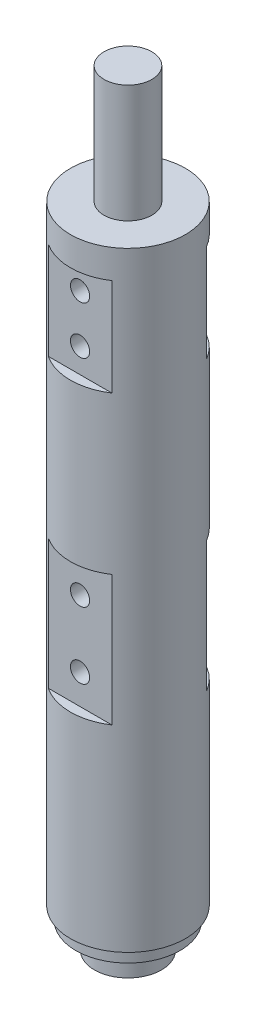
ISO-10303-21;
HEADER;
FILE_DESCRIPTION(('STEP AP214'),'2;1');
FILE_NAME('part.step','',(''),(''),'','','');
FILE_SCHEMA(('AUTOMOTIVE_DESIGN { 1 0 10303 214 1 1 1 1 }'));
ENDSEC;
DATA;
#1=APPLICATION_CONTEXT('core data for automotive mechanical design processes');
#2=APPLICATION_PROTOCOL_DEFINITION('international standard','automotive_design',2000,#1);
#3=PRODUCT_CONTEXT('',#1,'mechanical');
#4=PRODUCT('Part','Part','',(#3));
#5=PRODUCT_RELATED_PRODUCT_CATEGORY('part','',(#4));
#6=PRODUCT_DEFINITION_FORMATION('','',#4);
#7=PRODUCT_DEFINITION_CONTEXT('part definition',#1,'design');
#8=PRODUCT_DEFINITION('design','',#6,#7);
#9=PRODUCT_DEFINITION_SHAPE('','',#8);
#10=(LENGTH_UNIT() NAMED_UNIT(*) SI_UNIT(.MILLI.,.METRE.));
#11=(NAMED_UNIT(*) PLANE_ANGLE_UNIT() SI_UNIT($,.RADIAN.));
#12=(NAMED_UNIT(*) SI_UNIT($,.STERADIAN.) SOLID_ANGLE_UNIT());
#13=UNCERTAINTY_MEASURE_WITH_UNIT(LENGTH_MEASURE(1.E-05),#10,'distance_accuracy_value','');
#14=(GEOMETRIC_REPRESENTATION_CONTEXT(3) GLOBAL_UNCERTAINTY_ASSIGNED_CONTEXT((#13)) GLOBAL_UNIT_ASSIGNED_CONTEXT((#10,
#11,#12)) REPRESENTATION_CONTEXT('',''));
#15=CARTESIAN_POINT('',(0.,0.,0.));
#16=DIRECTION('',(0.,0.,1.));
#17=DIRECTION('',(1.,0.,0.));
#18=AXIS2_PLACEMENT_3D('',#15,#16,#17);
#19=CARTESIAN_POINT('',(0.,254.,0.));
#20=DIRECTION('',(0.,-1.,0.));
#21=DIRECTION('',(0.,0.,-1.));
#22=AXIS2_PLACEMENT_3D('',#19,#20,#21);
#23=CYLINDRICAL_SURFACE('',#22,19.05);
#24=DIRECTION('',(0.,-1.,0.));
#25=VECTOR('',#24,1.);
#26=CARTESIAN_POINT('',(10.5302837093785,254.,15.8749999999999));
#27=LINE('',#26,#25);
#28=CARTESIAN_POINT('',(10.5302837093785,121.158,15.8749999999999));
#29=VERTEX_POINT('',#28);
#30=CARTESIAN_POINT('',(10.5302837093785,77.978,15.8749999999999));
#31=VERTEX_POINT('',#30);
#32=EDGE_CURVE('E11',#29,#31,#27,.T.);
#33=ORIENTED_EDGE('',*,*,#32,.T.);
#34=CARTESIAN_POINT('',(0.,77.978,0.));
#35=DIRECTION('',(0.,-1.,0.));
#36=DIRECTION('',(0.,0.,-1.));
#37=AXIS2_PLACEMENT_3D('',#34,#35,#36);
#38=CIRCLE('',#37,19.05);
#39=CARTESIAN_POINT('',(-10.5302837093785,77.978,15.8749999999999));
#40=VERTEX_POINT('',#39);
#41=EDGE_CURVE('E96',#31,#40,#38,.T.);
#42=ORIENTED_EDGE('',*,*,#41,.T.);
#43=DIRECTION('',(0.,-1.,0.));
#44=VECTOR('',#43,1.);
#45=CARTESIAN_POINT('',(-10.5302837093785,254.,15.8749999999999));
#46=LINE('',#45,#44);
#47=CARTESIAN_POINT('',(-10.5302837093785,121.158,15.8749999999999));
#48=VERTEX_POINT('',#47);
#49=EDGE_CURVE('E100',#40,#48,#46,.F.);
#50=ORIENTED_EDGE('',*,*,#49,.T.);
#51=CARTESIAN_POINT('',(0.,121.158,0.));
#52=DIRECTION('',(0.,1.,0.));
#53=DIRECTION('',(0.,0.,1.));
#54=AXIS2_PLACEMENT_3D('',#51,#52,#53);
#55=CIRCLE('',#54,19.05);
#56=EDGE_CURVE('E40',#48,#29,#55,.T.);
#57=ORIENTED_EDGE('',*,*,#56,.T.);
#58=EDGE_LOOP('',(#33,#42,#50,#57));
#59=FACE_BOUND('',#58,.T.);
#60=DIRECTION('',(0.,-1.,0.));
#61=VECTOR('',#60,1.);
#62=CARTESIAN_POINT('',(10.5302837093785,254.,15.8749999999999));
#63=LINE('',#62,#61);
#64=CARTESIAN_POINT('',(10.5302837093785,205.486,15.8749999999999));
#65=VERTEX_POINT('',#64);
#66=CARTESIAN_POINT('',(10.5302837093785,173.228,15.8749999999999));
#67=VERTEX_POINT('',#66);
#68=EDGE_CURVE('E101',#65,#67,#63,.T.);
#69=ORIENTED_EDGE('',*,*,#68,.T.);
#70=CARTESIAN_POINT('',(0.,173.228,0.));
#71=DIRECTION('',(0.,-1.,0.));
#72=DIRECTION('',(0.,0.,-1.));
#73=AXIS2_PLACEMENT_3D('',#70,#71,#72);
#74=CIRCLE('',#73,19.05);
#75=CARTESIAN_POINT('',(-10.5302837093785,173.228,15.8749999999999));
#76=VERTEX_POINT('',#75);
#77=EDGE_CURVE('E202',#67,#76,#74,.T.);
#78=ORIENTED_EDGE('',*,*,#77,.T.);
#79=DIRECTION('',(0.,-1.,0.));
#80=VECTOR('',#79,1.);
#81=CARTESIAN_POINT('',(-10.5302837093785,254.,15.8749999999999));
#82=LINE('',#81,#80);
#83=CARTESIAN_POINT('',(-10.5302837093785,205.486,15.8749999999999));
#84=VERTEX_POINT('',#83);
#85=EDGE_CURVE('E205',#76,#84,#82,.F.);
#86=ORIENTED_EDGE('',*,*,#85,.T.);
#87=CARTESIAN_POINT('',(0.,205.486,0.));
#88=DIRECTION('',(0.,1.,0.));
#89=DIRECTION('',(0.,0.,1.));
#90=AXIS2_PLACEMENT_3D('',#87,#88,#89);
#91=CIRCLE('',#90,19.05);
#92=EDGE_CURVE('E208',#84,#65,#91,.T.);
#93=ORIENTED_EDGE('',*,*,#92,.T.);
#94=EDGE_LOOP('',(#69,#78,#86,#93));
#95=FACE_BOUND('',#94,.T.);
#96=CARTESIAN_POINT('',(0.,77.978,0.));
#97=DIRECTION('',(0.,-1.,0.));
#98=DIRECTION('',(0.,0.,-1.));
#99=AXIS2_PLACEMENT_3D('',#96,#97,#98);
#100=CIRCLE('',#99,19.05);
#101=CARTESIAN_POINT('',(-16.4977839420936,77.978,-9.52500000000001));
#102=VERTEX_POINT('',#101);
#103=CARTESIAN_POINT('',(16.4977839420936,77.978,-9.52500000000001));
#104=VERTEX_POINT('',#103);
#105=EDGE_CURVE('E200',#102,#104,#100,.T.);
#106=ORIENTED_EDGE('',*,*,#105,.T.);
#107=DIRECTION('',(0.,-1.,0.));
#108=VECTOR('',#107,1.);
#109=CARTESIAN_POINT('',(16.4977839420936,254.,-9.52499999999998));
#110=LINE('',#109,#108);
#111=CARTESIAN_POINT('',(16.4977839420936,121.158,-9.525));
#112=VERTEX_POINT('',#111);
#113=EDGE_CURVE('E194',#104,#112,#110,.F.);
#114=ORIENTED_EDGE('',*,*,#113,.T.);
#115=CARTESIAN_POINT('',(0.,121.158,0.));
#116=DIRECTION('',(0.,1.,0.));
#117=DIRECTION('',(0.,0.,1.));
#118=AXIS2_PLACEMENT_3D('',#115,#116,#117);
#119=CIRCLE('',#118,19.05);
#120=CARTESIAN_POINT('',(-16.4977839420936,121.158,-9.525));
#121=VERTEX_POINT('',#120);
#122=EDGE_CURVE('E191',#112,#121,#119,.T.);
#123=ORIENTED_EDGE('',*,*,#122,.T.);
#124=DIRECTION('',(0.,-1.,0.));
#125=VECTOR('',#124,1.);
#126=CARTESIAN_POINT('',(-16.4977839420936,254.,-9.52499999999998));
#127=LINE('',#126,#125);
#128=EDGE_CURVE('E197',#121,#102,#127,.T.);
#129=ORIENTED_EDGE('',*,*,#128,.T.);
#130=EDGE_LOOP('',(#106,#114,#123,#129));
#131=FACE_BOUND('',#130,.T.);
#132=CARTESIAN_POINT('',(0.,173.228,0.));
#133=DIRECTION('',(0.,-1.,0.));
#134=DIRECTION('',(0.,0.,-1.));
#135=AXIS2_PLACEMENT_3D('',#132,#133,#134);
#136=CIRCLE('',#135,19.05);
#137=CARTESIAN_POINT('',(-16.4977839420936,173.228,-9.525));
#138=VERTEX_POINT('',#137);
#139=CARTESIAN_POINT('',(16.4977839420935,173.228,-9.525));
#140=VERTEX_POINT('',#139);
#141=EDGE_CURVE('E189',#138,#140,#136,.T.);
#142=ORIENTED_EDGE('',*,*,#141,.T.);
#143=DIRECTION('',(0.,-1.,0.));
#144=VECTOR('',#143,1.);
#145=CARTESIAN_POINT('',(16.4977839420936,254.,-9.52499999999999));
#146=LINE('',#145,#144);
#147=CARTESIAN_POINT('',(16.4977839420936,205.486,-9.52499999999999));
#148=VERTEX_POINT('',#147);
#149=EDGE_CURVE('E183',#140,#148,#146,.F.);
#150=ORIENTED_EDGE('',*,*,#149,.T.);
#151=CARTESIAN_POINT('',(0.,205.486,0.));
#152=DIRECTION('',(0.,1.,0.));
#153=DIRECTION('',(0.,0.,1.));
#154=AXIS2_PLACEMENT_3D('',#151,#152,#153);
#155=CIRCLE('',#154,19.05);
#156=CARTESIAN_POINT('',(-16.4977839420936,205.486,-9.52499999999999));
#157=VERTEX_POINT('',#156);
#158=EDGE_CURVE('E180',#148,#157,#155,.T.);
#159=ORIENTED_EDGE('',*,*,#158,.T.);
#160=DIRECTION('',(0.,-1.,0.));
#161=VECTOR('',#160,1.);
#162=CARTESIAN_POINT('',(-16.4977839420936,254.,-9.52499999999999));
#163=LINE('',#162,#161);
#164=EDGE_CURVE('E186',#157,#138,#163,.T.);
#165=ORIENTED_EDGE('',*,*,#164,.T.);
#166=EDGE_LOOP('',(#142,#150,#159,#165));
#167=FACE_BOUND('',#166,.T.);
#168=CARTESIAN_POINT('',(0.,12.954,0.));
#169=DIRECTION('',(0.,1.,0.));
#170=DIRECTION('',(0.,0.,1.));
#171=AXIS2_PLACEMENT_3D('',#168,#169,#170);
#172=CIRCLE('',#171,19.05);
#173=CARTESIAN_POINT('',(0.,12.954,19.05));
#174=VERTEX_POINT('',#173);
#175=EDGE_CURVE('E165',#174,#174,#172,.T.);
#176=ORIENTED_EDGE('',*,*,#175,.T.);
#177=EDGE_LOOP('',(#176));
#178=FACE_BOUND('',#177,.T.);
#179=CARTESIAN_POINT('',(0.,215.011,0.));
#180=DIRECTION('',(0.,1.,0.));
#181=DIRECTION('',(0.,0.,1.));
#182=AXIS2_PLACEMENT_3D('',#179,#180,#181);
#183=CIRCLE('',#182,19.05);
#184=CARTESIAN_POINT('',(0.,215.011,19.05));
#185=VERTEX_POINT('',#184);
#186=EDGE_CURVE('E154',#185,#185,#183,.T.);
#187=ORIENTED_EDGE('',*,*,#186,.F.);
#188=EDGE_LOOP('',(#187));
#189=FACE_BOUND('',#188,.T.);
#190=ADVANCED_FACE('F32',(#59,#95,#131,#167,#178,#189),#23,.T.);
#191=CARTESIAN_POINT('',(0.,348.337253791726,0.));
#192=DIRECTION('',(0.,1.,0.));
#193=DIRECTION('',(0.,0.,1.));
#194=AXIS2_PLACEMENT_3D('',#191,#192,#193);
#195=CYLINDRICAL_SURFACE('',#194,11.1125);
#196=CARTESIAN_POINT('',(0.,0.,0.));
#197=DIRECTION('',(0.,1.,0.));
#198=DIRECTION('',(0.,0.,1.));
#199=AXIS2_PLACEMENT_3D('',#196,#197,#198);
#200=CIRCLE('',#199,11.1125);
#201=CARTESIAN_POINT('',(0.,0.,11.1125));
#202=VERTEX_POINT('',#201);
#203=EDGE_CURVE('E177',#202,#202,#200,.T.);
#204=ORIENTED_EDGE('',*,*,#203,.T.);
#205=EDGE_LOOP('',(#204));
#206=FACE_BOUND('',#205,.T.);
#207=CARTESIAN_POINT('',(0.,8.63599999999998,0.));
#208=DIRECTION('',(0.,1.,0.));
#209=DIRECTION('',(0.,0.,1.));
#210=AXIS2_PLACEMENT_3D('',#207,#208,#209);
#211=CIRCLE('',#210,11.1125);
#212=CARTESIAN_POINT('',(0.,8.63599999999998,11.1125));
#213=VERTEX_POINT('',#212);
#214=EDGE_CURVE('E174',#213,#213,#211,.T.);
#215=ORIENTED_EDGE('',*,*,#214,.F.);
#216=EDGE_LOOP('',(#215));
#217=FACE_BOUND('',#216,.T.);
#218=ADVANCED_FACE('F234',(#206,#217),#195,.T.);
#219=CARTESIAN_POINT('',(11.1125,8.636,0.));
#220=DIRECTION('',(0.,-1.,0.));
#221=DIRECTION('',(0.,0.,-1.));
#222=AXIS2_PLACEMENT_3D('',#219,#220,#221);
#223=PLANE('',#222);
#224=ORIENTED_EDGE('',*,*,#214,.T.);
#225=EDGE_LOOP('',(#224));
#226=FACE_BOUND('',#225,.T.);
#227=CARTESIAN_POINT('',(0.,8.63599999999998,0.));
#228=DIRECTION('',(0.,1.,0.));
#229=DIRECTION('',(0.,0.,1.));
#230=AXIS2_PLACEMENT_3D('',#227,#228,#229);
#231=CIRCLE('',#230,17.272);
#232=CARTESIAN_POINT('',(0.,8.63599999999998,17.272));
#233=VERTEX_POINT('',#232);
#234=EDGE_CURVE('E171',#233,#233,#231,.T.);
#235=ORIENTED_EDGE('',*,*,#234,.F.);
#236=EDGE_LOOP('',(#235));
#237=FACE_BOUND('',#236,.T.);
#238=ADVANCED_FACE('F238',(#226,#237),#223,.T.);
#239=CARTESIAN_POINT('',(0.,348.337253791726,0.));
#240=DIRECTION('',(0.,1.,0.));
#241=DIRECTION('',(0.,0.,1.));
#242=AXIS2_PLACEMENT_3D('',#239,#240,#241);
#243=CYLINDRICAL_SURFACE('',#242,17.272);
#244=ORIENTED_EDGE('',*,*,#234,.T.);
#245=EDGE_LOOP('',(#244));
#246=FACE_BOUND('',#245,.T.);
#247=CARTESIAN_POINT('',(0.,12.954,0.));
#248=DIRECTION('',(0.,1.,0.));
#249=DIRECTION('',(0.,0.,1.));
#250=AXIS2_PLACEMENT_3D('',#247,#248,#249);
#251=CIRCLE('',#250,17.272);
#252=CARTESIAN_POINT('',(0.,12.954,17.272));
#253=VERTEX_POINT('',#252);
#254=EDGE_CURVE('E168',#253,#253,#251,.T.);
#255=ORIENTED_EDGE('',*,*,#254,.F.);
#256=EDGE_LOOP('',(#255));
#257=FACE_BOUND('',#256,.T.);
#258=ADVANCED_FACE('F244',(#246,#257),#243,.T.);
#259=CARTESIAN_POINT('',(17.272,12.954,0.));
#260=DIRECTION('',(0.,-1.,0.));
#261=DIRECTION('',(0.,0.,-1.));
#262=AXIS2_PLACEMENT_3D('',#259,#260,#261);
#263=PLANE('',#262);
#264=ORIENTED_EDGE('',*,*,#254,.T.);
#265=EDGE_LOOP('',(#264));
#266=FACE_BOUND('',#265,.T.);
#267=ORIENTED_EDGE('',*,*,#175,.F.);
#268=EDGE_LOOP('',(#267));
#269=FACE_BOUND('',#268,.T.);
#270=ADVANCED_FACE('F258',(#266,#269),#263,.T.);
#271=CARTESIAN_POINT('',(0.,0.,0.));
#272=DIRECTION('',(0.,1.,0.));
#273=DIRECTION('',(0.,0.,1.));
#274=AXIS2_PLACEMENT_3D('',#271,#272,#273);
#275=PLANE('',#274);
#276=ORIENTED_EDGE('',*,*,#203,.F.);
#277=EDGE_LOOP('',(#276));
#278=FACE_BOUND('',#277,.T.);
#279=ADVANCED_FACE('F255',(#278),#275,.F.);
#280=CARTESIAN_POINT('',(19.05,215.011,0.));
#281=DIRECTION('',(0.,1.,0.));
#282=DIRECTION('',(0.,0.,1.));
#283=AXIS2_PLACEMENT_3D('',#280,#281,#282);
#284=PLANE('',#283);
#285=ORIENTED_EDGE('',*,*,#186,.T.);
#286=EDGE_LOOP('',(#285));
#287=FACE_BOUND('',#286,.T.);
#288=CARTESIAN_POINT('',(0.,215.011,0.));
#289=DIRECTION('',(0.,1.,0.));
#290=DIRECTION('',(0.,0.,1.));
#291=AXIS2_PLACEMENT_3D('',#288,#289,#290);
#292=CIRCLE('',#291,7.9375);
#293=CARTESIAN_POINT('',(0.,215.011,7.9375));
#294=VERTEX_POINT('',#293);
#295=EDGE_CURVE('E162',#294,#294,#292,.T.);
#296=ORIENTED_EDGE('',*,*,#295,.F.);
#297=EDGE_LOOP('',(#296));
#298=FACE_BOUND('',#297,.T.);
#299=ADVANCED_FACE('F257',(#287,#298),#284,.T.);
#300=CARTESIAN_POINT('',(0.,348.337253791726,0.));
#301=DIRECTION('',(0.,1.,0.));
#302=DIRECTION('',(0.,0.,1.));
#303=AXIS2_PLACEMENT_3D('',#300,#301,#302);
#304=CYLINDRICAL_SURFACE('',#303,7.9375);
#305=ORIENTED_EDGE('',*,*,#295,.T.);
#306=EDGE_LOOP('',(#305));
#307=FACE_BOUND('',#306,.T.);
#308=CARTESIAN_POINT('',(0.,254.,0.));
#309=DIRECTION('',(0.,1.,0.));
#310=DIRECTION('',(0.,0.,1.));
#311=AXIS2_PLACEMENT_3D('',#308,#309,#310);
#312=CIRCLE('',#311,7.9375);
#313=CARTESIAN_POINT('',(0.,254.,7.9375));
#314=VERTEX_POINT('',#313);
#315=EDGE_CURVE('E159',#314,#314,#312,.T.);
#316=ORIENTED_EDGE('',*,*,#315,.F.);
#317=EDGE_LOOP('',(#316));
#318=FACE_BOUND('',#317,.T.);
#319=ADVANCED_FACE('F253',(#307,#318),#304,.T.);
#320=CARTESIAN_POINT('',(0.,254.,0.));
#321=DIRECTION('',(0.,1.,0.));
#322=DIRECTION('',(0.,0.,1.));
#323=AXIS2_PLACEMENT_3D('',#320,#321,#322);
#324=PLANE('',#323);
#325=ORIENTED_EDGE('',*,*,#315,.T.);
#326=EDGE_LOOP('',(#325));
#327=FACE_BOUND('',#326,.T.);
#328=ADVANCED_FACE('F250',(#327),#324,.T.);
#329=CARTESIAN_POINT('',(-19.05,173.228,-19.05));
#330=DIRECTION('',(0.,-1.,0.));
#331=DIRECTION('',(0.,0.,-1.));
#332=AXIS2_PLACEMENT_3D('',#329,#330,#331);
#333=PLANE('',#332);
#334=ORIENTED_EDGE('',*,*,#141,.F.);
#335=DIRECTION('',(1.,0.,0.));
#336=VECTOR('',#335,1.);
#337=CARTESIAN_POINT('',(-19.05,173.228,-9.525));
#338=LINE('',#337,#336);
#339=EDGE_CURVE('E151',#138,#140,#338,.T.);
#340=ORIENTED_EDGE('',*,*,#339,.T.);
#341=EDGE_LOOP('',(#334,#340));
#342=FACE_BOUND('',#341,.T.);
#343=ADVANCED_FACE('F252',(#342),#333,.F.);
#344=CARTESIAN_POINT('',(-19.05,205.486,-9.525));
#345=DIRECTION('',(0.,0.,1.));
#346=DIRECTION('',(1.,0.,0.));
#347=AXIS2_PLACEMENT_3D('',#344,#345,#346);
#348=PLANE('',#347);
#349=CARTESIAN_POINT('',(0.,197.2945,-9.52500000000001));
#350=DIRECTION('',(0.,0.,-1.));
#351=DIRECTION('',(0.,1.,0.));
#352=AXIS2_PLACEMENT_3D('',#349,#350,#351);
#353=CIRCLE('',#352,3.17499999999999);
#354=CARTESIAN_POINT('',(0.,200.4695,-9.52500000000001));
#355=VERTEX_POINT('',#354);
#356=EDGE_CURVE('E134',#355,#355,#353,.T.);
#357=ORIENTED_EDGE('',*,*,#356,.F.);
#358=EDGE_LOOP('',(#357));
#359=FACE_BOUND('',#358,.T.);
#360=CARTESIAN_POINT('',(0.,181.4195,-9.52500000000001));
#361=DIRECTION('',(0.,0.,-1.));
#362=DIRECTION('',(0.,1.,0.));
#363=AXIS2_PLACEMENT_3D('',#360,#361,#362);
#364=CIRCLE('',#363,3.17499999999999);
#365=CARTESIAN_POINT('',(0.,184.5945,-9.52500000000001));
#366=VERTEX_POINT('',#365);
#367=EDGE_CURVE('E124',#366,#366,#364,.T.);
#368=ORIENTED_EDGE('',*,*,#367,.F.);
#369=EDGE_LOOP('',(#368));
#370=FACE_BOUND('',#369,.T.);
#371=DIRECTION('',(1.,0.,0.));
#372=VECTOR('',#371,1.);
#373=CARTESIAN_POINT('',(-19.05,205.486,-9.525));
#374=LINE('',#373,#372);
#375=EDGE_CURVE('E148',#157,#148,#374,.T.);
#376=ORIENTED_EDGE('',*,*,#375,.T.);
#377=ORIENTED_EDGE('',*,*,#149,.F.);
#378=ORIENTED_EDGE('',*,*,#339,.F.);
#379=ORIENTED_EDGE('',*,*,#164,.F.);
#380=EDGE_LOOP('',(#376,#377,#378,#379));
#381=FACE_BOUND('',#380,.T.);
#382=ADVANCED_FACE('F282',(#359,#370,#381),#348,.F.);
#383=CARTESIAN_POINT('',(-19.05,205.486,-19.05));
#384=DIRECTION('',(0.,1.,0.));
#385=DIRECTION('',(0.,0.,1.));
#386=AXIS2_PLACEMENT_3D('',#383,#384,#385);
#387=PLANE('',#386);
#388=ORIENTED_EDGE('',*,*,#375,.F.);
#389=ORIENTED_EDGE('',*,*,#158,.F.);
#390=EDGE_LOOP('',(#388,#389));
#391=FACE_BOUND('',#390,.T.);
#392=ADVANCED_FACE('F278',(#391),#387,.F.);
#393=CARTESIAN_POINT('',(-19.05,77.978,-19.05));
#394=DIRECTION('',(0.,-1.,0.));
#395=DIRECTION('',(0.,0.,-1.));
#396=AXIS2_PLACEMENT_3D('',#393,#394,#395);
#397=PLANE('',#396);
#398=ORIENTED_EDGE('',*,*,#105,.F.);
#399=DIRECTION('',(1.,0.,0.));
#400=VECTOR('',#399,1.);
#401=CARTESIAN_POINT('',(-19.05,77.978,-9.52500000000001));
#402=LINE('',#401,#400);
#403=EDGE_CURVE('E145',#102,#104,#402,.T.);
#404=ORIENTED_EDGE('',*,*,#403,.T.);
#405=EDGE_LOOP('',(#398,#404));
#406=FACE_BOUND('',#405,.T.);
#407=ADVANCED_FACE('F281',(#406),#397,.F.);
#408=CARTESIAN_POINT('',(-19.05,121.158,-9.525));
#409=DIRECTION('',(0.,0.,1.));
#410=DIRECTION('',(0.,-1.,0.));
#411=AXIS2_PLACEMENT_3D('',#408,#409,#410);
#412=PLANE('',#411);
#413=CARTESIAN_POINT('',(0.,109.982,-9.525));
#414=DIRECTION('',(0.,0.,-1.));
#415=DIRECTION('',(0.,1.,0.));
#416=AXIS2_PLACEMENT_3D('',#413,#414,#415);
#417=CIRCLE('',#416,3.17499999999999);
#418=CARTESIAN_POINT('',(0.,113.157,-9.525));
#419=VERTEX_POINT('',#418);
#420=EDGE_CURVE('E121',#419,#419,#417,.T.);
#421=ORIENTED_EDGE('',*,*,#420,.F.);
#422=EDGE_LOOP('',(#421));
#423=FACE_BOUND('',#422,.T.);
#424=CARTESIAN_POINT('',(0.,87.884,-9.525));
#425=DIRECTION('',(0.,0.,-1.));
#426=DIRECTION('',(0.,1.,0.));
#427=AXIS2_PLACEMENT_3D('',#424,#425,#426);
#428=CIRCLE('',#427,3.17499999999999);
#429=CARTESIAN_POINT('',(0.,91.059,-9.525));
#430=VERTEX_POINT('',#429);
#431=EDGE_CURVE('E118',#430,#430,#428,.T.);
#432=ORIENTED_EDGE('',*,*,#431,.F.);
#433=EDGE_LOOP('',(#432));
#434=FACE_BOUND('',#433,.T.);
#435=DIRECTION('',(1.,0.,0.));
#436=VECTOR('',#435,1.);
#437=CARTESIAN_POINT('',(-19.05,121.158,-9.525));
#438=LINE('',#437,#436);
#439=EDGE_CURVE('E143',#121,#112,#438,.T.);
#440=ORIENTED_EDGE('',*,*,#439,.T.);
#441=ORIENTED_EDGE('',*,*,#113,.F.);
#442=ORIENTED_EDGE('',*,*,#403,.F.);
#443=ORIENTED_EDGE('',*,*,#128,.F.);
#444=EDGE_LOOP('',(#440,#441,#442,#443));
#445=FACE_BOUND('',#444,.T.);
#446=ADVANCED_FACE('F228',(#423,#434,#445),#412,.F.);
#447=CARTESIAN_POINT('',(-19.05,121.158,-19.05));
#448=DIRECTION('',(0.,1.,0.));
#449=DIRECTION('',(0.,0.,1.));
#450=AXIS2_PLACEMENT_3D('',#447,#448,#449);
#451=PLANE('',#450);
#452=ORIENTED_EDGE('',*,*,#439,.F.);
#453=ORIENTED_EDGE('',*,*,#122,.F.);
#454=EDGE_LOOP('',(#452,#453));
#455=FACE_BOUND('',#454,.T.);
#456=ADVANCED_FACE('F219',(#455),#451,.F.);
#457=CARTESIAN_POINT('',(-19.05,205.486,19.0499999999999));
#458=DIRECTION('',(0.,1.,0.));
#459=DIRECTION('',(0.,0.,1.));
#460=AXIS2_PLACEMENT_3D('',#457,#458,#459);
#461=PLANE('',#460);
#462=ORIENTED_EDGE('',*,*,#92,.F.);
#463=DIRECTION('',(1.,0.,0.));
#464=VECTOR('',#463,1.);
#465=CARTESIAN_POINT('',(-19.05,205.486,15.8749999999999));
#466=LINE('',#465,#464);
#467=EDGE_CURVE('E140',#84,#65,#466,.T.);
#468=ORIENTED_EDGE('',*,*,#467,.T.);
#469=EDGE_LOOP('',(#462,#468));
#470=FACE_BOUND('',#469,.T.);
#471=ADVANCED_FACE('F217',(#470),#461,.F.);
#472=CARTESIAN_POINT('',(-19.05,205.486,15.8749999999999));
#473=DIRECTION('',(0.,0.,-1.));
#474=DIRECTION('',(-1.,0.,0.));
#475=AXIS2_PLACEMENT_3D('',#472,#473,#474);
#476=PLANE('',#475);
#477=CARTESIAN_POINT('',(0.,197.2945,15.8749999999999));
#478=DIRECTION('',(0.,0.,-1.));
#479=DIRECTION('',(-1.,0.,0.));
#480=AXIS2_PLACEMENT_3D('',#477,#478,#479);
#481=CIRCLE('',#480,3.17499999999999);
#482=CARTESIAN_POINT('',(-3.17500000000001,197.2945,15.8749999999999));
#483=VERTEX_POINT('',#482);
#484=EDGE_CURVE('E35',#483,#483,#481,.T.);
#485=ORIENTED_EDGE('',*,*,#484,.T.);
#486=EDGE_LOOP('',(#485));
#487=FACE_BOUND('',#486,.T.);
#488=CARTESIAN_POINT('',(0.,181.4195,15.8749999999999));
#489=DIRECTION('',(0.,0.,-1.));
#490=DIRECTION('',(-1.,0.,0.));
#491=AXIS2_PLACEMENT_3D('',#488,#489,#490);
#492=CIRCLE('',#491,3.17499999999999);
#493=CARTESIAN_POINT('',(-3.17500000000001,181.4195,15.8749999999999));
#494=VERTEX_POINT('',#493);
#495=EDGE_CURVE('E122',#494,#494,#492,.T.);
#496=ORIENTED_EDGE('',*,*,#495,.T.);
#497=EDGE_LOOP('',(#496));
#498=FACE_BOUND('',#497,.T.);
#499=ORIENTED_EDGE('',*,*,#467,.F.);
#500=ORIENTED_EDGE('',*,*,#85,.F.);
#501=DIRECTION('',(1.,0.,0.));
#502=VECTOR('',#501,1.);
#503=CARTESIAN_POINT('',(-19.05,173.228,15.8749999999999));
#504=LINE('',#503,#502);
#505=EDGE_CURVE('E54',#76,#67,#504,.T.);
#506=ORIENTED_EDGE('',*,*,#505,.T.);
#507=ORIENTED_EDGE('',*,*,#68,.F.);
#508=EDGE_LOOP('',(#499,#500,#506,#507));
#509=FACE_BOUND('',#508,.T.);
#510=ADVANCED_FACE('F215',(#487,#498,#509),#476,.F.);
#511=CARTESIAN_POINT('',(-19.05,173.228,15.8749999999999));
#512=DIRECTION('',(0.,-1.,0.));
#513=DIRECTION('',(0.,0.,-1.));
#514=AXIS2_PLACEMENT_3D('',#511,#512,#513);
#515=PLANE('',#514);
#516=ORIENTED_EDGE('',*,*,#505,.F.);
#517=ORIENTED_EDGE('',*,*,#77,.F.);
#518=EDGE_LOOP('',(#516,#517));
#519=FACE_BOUND('',#518,.T.);
#520=ADVANCED_FACE('F225',(#519),#515,.F.);
#521=CARTESIAN_POINT('',(-19.05,121.158,19.0499999999999));
#522=DIRECTION('',(0.,1.,0.));
#523=DIRECTION('',(0.,0.,1.));
#524=AXIS2_PLACEMENT_3D('',#521,#522,#523);
#525=PLANE('',#524);
#526=ORIENTED_EDGE('',*,*,#56,.F.);
#527=DIRECTION('',(1.,0.,0.));
#528=VECTOR('',#527,1.);
#529=CARTESIAN_POINT('',(-19.05,121.158,15.8749999999999));
#530=LINE('',#529,#528);
#531=EDGE_CURVE('E108',#48,#29,#530,.T.);
#532=ORIENTED_EDGE('',*,*,#531,.T.);
#533=EDGE_LOOP('',(#526,#532));
#534=FACE_BOUND('',#533,.T.);
#535=ADVANCED_FACE('F339',(#534),#525,.F.);
#536=CARTESIAN_POINT('',(-19.05,121.158,15.8749999999999));
#537=DIRECTION('',(0.,0.,-1.));
#538=DIRECTION('',(0.,1.,0.));
#539=AXIS2_PLACEMENT_3D('',#536,#537,#538);
#540=PLANE('',#539);
#541=CARTESIAN_POINT('',(0.,109.982,15.8749999999999));
#542=DIRECTION('',(0.,0.,-1.));
#543=DIRECTION('',(0.,1.,0.));
#544=AXIS2_PLACEMENT_3D('',#541,#542,#543);
#545=CIRCLE('',#544,3.17499999999999);
#546=CARTESIAN_POINT('',(0.,113.157,15.8749999999999));
#547=VERTEX_POINT('',#546);
#548=EDGE_CURVE('E119',#547,#547,#545,.T.);
#549=ORIENTED_EDGE('',*,*,#548,.T.);
#550=EDGE_LOOP('',(#549));
#551=FACE_BOUND('',#550,.T.);
#552=CARTESIAN_POINT('',(0.,87.884,15.8749999999999));
#553=DIRECTION('',(0.,0.,-1.));
#554=DIRECTION('',(0.,1.,0.));
#555=AXIS2_PLACEMENT_3D('',#552,#553,#554);
#556=CIRCLE('',#555,3.17499999999999);
#557=CARTESIAN_POINT('',(0.,91.059,15.8749999999999));
#558=VERTEX_POINT('',#557);
#559=EDGE_CURVE('E109',#558,#558,#556,.T.);
#560=ORIENTED_EDGE('',*,*,#559,.T.);
#561=EDGE_LOOP('',(#560));
#562=FACE_BOUND('',#561,.T.);
#563=ORIENTED_EDGE('',*,*,#531,.F.);
#564=ORIENTED_EDGE('',*,*,#49,.F.);
#565=DIRECTION('',(1.,0.,0.));
#566=VECTOR('',#565,1.);
#567=CARTESIAN_POINT('',(-19.05,77.978,15.8749999999999));
#568=LINE('',#567,#566);
#569=EDGE_CURVE('E47',#40,#31,#568,.T.);
#570=ORIENTED_EDGE('',*,*,#569,.T.);
#571=ORIENTED_EDGE('',*,*,#32,.F.);
#572=EDGE_LOOP('',(#563,#564,#570,#571));
#573=FACE_BOUND('',#572,.T.);
#574=ADVANCED_FACE('F106',(#551,#562,#573),#540,.F.);
#575=CARTESIAN_POINT('',(-19.05,77.978,15.8749999999999));
#576=DIRECTION('',(0.,-1.,0.));
#577=DIRECTION('',(0.,0.,-1.));
#578=AXIS2_PLACEMENT_3D('',#575,#576,#577);
#579=PLANE('',#578);
#580=ORIENTED_EDGE('',*,*,#569,.F.);
#581=ORIENTED_EDGE('',*,*,#41,.F.);
#582=EDGE_LOOP('',(#580,#581));
#583=FACE_BOUND('',#582,.T.);
#584=ADVANCED_FACE('F97',(#583),#579,.F.);
#585=CARTESIAN_POINT('',(0.,87.884,-9.525));
#586=DIRECTION('',(0.,0.,-1.));
#587=DIRECTION('',(0.,1.,0.));
#588=AXIS2_PLACEMENT_3D('',#585,#586,#587);
#589=CYLINDRICAL_SURFACE('',#588,3.17499999999999);
#590=ORIENTED_EDGE('',*,*,#431,.T.);
#591=EDGE_LOOP('',(#590));
#592=FACE_BOUND('',#591,.T.);
#593=ORIENTED_EDGE('',*,*,#559,.F.);
#594=EDGE_LOOP('',(#593));
#595=FACE_BOUND('',#594,.T.);
#596=ADVANCED_FACE('F356',(#592,#595),#589,.F.);
#597=CARTESIAN_POINT('',(0.,109.982,-9.525));
#598=DIRECTION('',(0.,0.,-1.));
#599=DIRECTION('',(0.,1.,0.));
#600=AXIS2_PLACEMENT_3D('',#597,#598,#599);
#601=CYLINDRICAL_SURFACE('',#600,3.17499999999999);
#602=ORIENTED_EDGE('',*,*,#420,.T.);
#603=EDGE_LOOP('',(#602));
#604=FACE_BOUND('',#603,.T.);
#605=ORIENTED_EDGE('',*,*,#548,.F.);
#606=EDGE_LOOP('',(#605));
#607=FACE_BOUND('',#606,.T.);
#608=ADVANCED_FACE('F433',(#604,#607),#601,.F.);
#609=CARTESIAN_POINT('',(0.,181.4195,-9.52500000000001));
#610=DIRECTION('',(0.,0.,-1.));
#611=DIRECTION('',(0.,1.,0.));
#612=AXIS2_PLACEMENT_3D('',#609,#610,#611);
#613=CYLINDRICAL_SURFACE('',#612,3.17499999999999);
#614=ORIENTED_EDGE('',*,*,#367,.T.);
#615=EDGE_LOOP('',(#614));
#616=FACE_BOUND('',#615,.T.);
#617=ORIENTED_EDGE('',*,*,#495,.F.);
#618=EDGE_LOOP('',(#617));
#619=FACE_BOUND('',#618,.T.);
#620=ADVANCED_FACE('F440',(#616,#619),#613,.F.);
#621=CARTESIAN_POINT('',(0.,197.2945,-9.52500000000001));
#622=DIRECTION('',(0.,0.,-1.));
#623=DIRECTION('',(0.,1.,0.));
#624=AXIS2_PLACEMENT_3D('',#621,#622,#623);
#625=CYLINDRICAL_SURFACE('',#624,3.17499999999999);
#626=ORIENTED_EDGE('',*,*,#356,.T.);
#627=EDGE_LOOP('',(#626));
#628=FACE_BOUND('',#627,.T.);
#629=ORIENTED_EDGE('',*,*,#484,.F.);
#630=EDGE_LOOP('',(#629));
#631=FACE_BOUND('',#630,.T.);
#632=ADVANCED_FACE('F448',(#628,#631),#625,.F.);
#633=CLOSED_SHELL('',(#190,#218,#238,#258,#270,#279,#299,#319,#328,#343,#382,#392,#407,#446,
#456,#471,#510,#520,#535,#574,#584,#596,#608,#620,#632));
#634=MANIFOLD_SOLID_BREP('B2',#633);
#635=ADVANCED_BREP_SHAPE_REPRESENTATION('',(#18,#634),#14);
#636=SHAPE_DEFINITION_REPRESENTATION(#9,#635);
ENDSEC;
END-ISO-10303-21;
